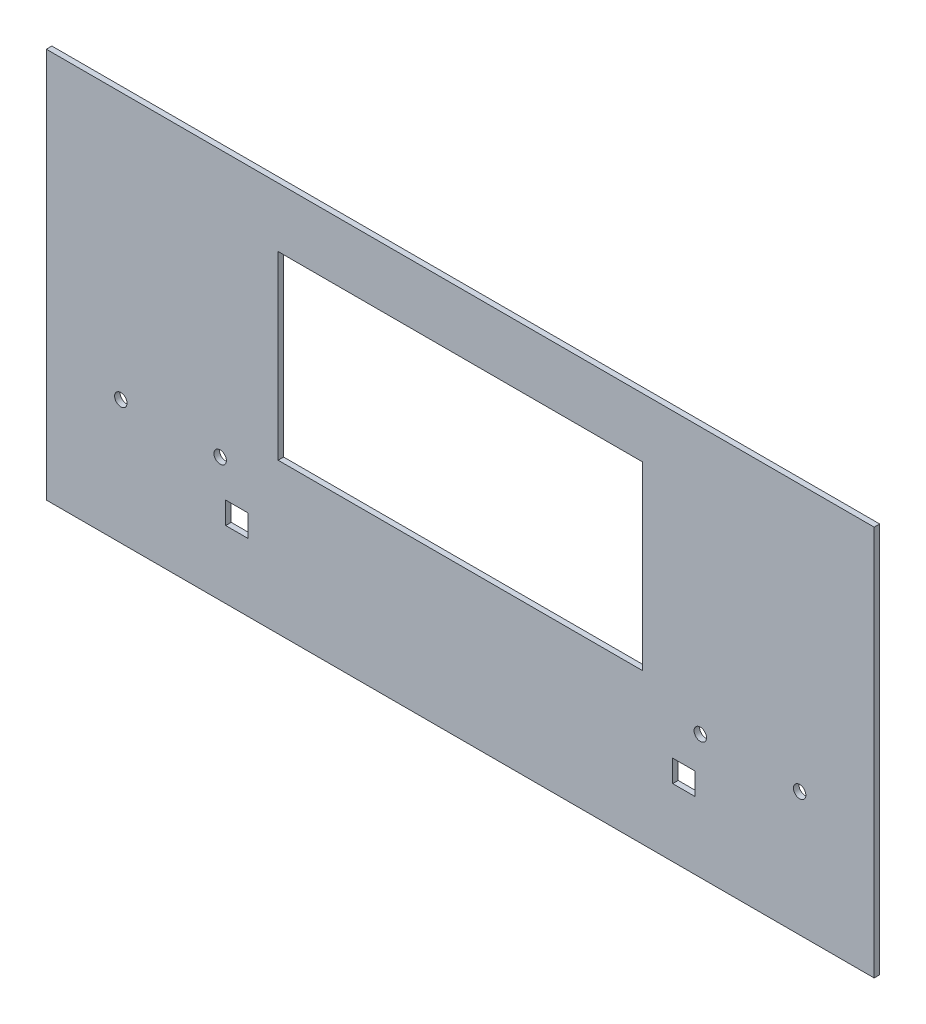
ISO-10303-21;
HEADER;
FILE_DESCRIPTION(('STEP AP214'),'2;1');
FILE_NAME('part.step','',(''),(''),'','','');
FILE_SCHEMA(('AUTOMOTIVE_DESIGN { 1 0 10303 214 1 1 1 1 }'));
ENDSEC;
DATA;
#1=APPLICATION_CONTEXT('core data for automotive mechanical design processes');
#2=APPLICATION_PROTOCOL_DEFINITION('international standard','automotive_design',2000,#1);
#3=PRODUCT_CONTEXT('',#1,'mechanical');
#4=PRODUCT('Part','Part','',(#3));
#5=PRODUCT_RELATED_PRODUCT_CATEGORY('part','',(#4));
#6=PRODUCT_DEFINITION_FORMATION('','',#4);
#7=PRODUCT_DEFINITION_CONTEXT('part definition',#1,'design');
#8=PRODUCT_DEFINITION('design','',#6,#7);
#9=PRODUCT_DEFINITION_SHAPE('','',#8);
#10=(LENGTH_UNIT() NAMED_UNIT(*) SI_UNIT(.MILLI.,.METRE.));
#11=(NAMED_UNIT(*) PLANE_ANGLE_UNIT() SI_UNIT($,.RADIAN.));
#12=(NAMED_UNIT(*) SI_UNIT($,.STERADIAN.) SOLID_ANGLE_UNIT());
#13=UNCERTAINTY_MEASURE_WITH_UNIT(LENGTH_MEASURE(1.E-05),#10,'distance_accuracy_value','');
#14=(GEOMETRIC_REPRESENTATION_CONTEXT(3) GLOBAL_UNCERTAINTY_ASSIGNED_CONTEXT((#13)) GLOBAL_UNIT_ASSIGNED_CONTEXT((#10,
#11,#12)) REPRESENTATION_CONTEXT('',''));
#15=CARTESIAN_POINT('',(0.,0.,0.));
#16=DIRECTION('',(0.,0.,1.));
#17=DIRECTION('',(1.,0.,0.));
#18=AXIS2_PLACEMENT_3D('',#15,#16,#17);
#19=CARTESIAN_POINT('',(0.,0.,2.));
#20=DIRECTION('',(0.,0.,-1.));
#21=DIRECTION('',(-1.,0.,0.));
#22=AXIS2_PLACEMENT_3D('',#19,#20,#21);
#23=PLANE('',#22);
#24=DIRECTION('',(0.,-1.,0.));
#25=VECTOR('',#24,1.);
#26=CARTESIAN_POINT('',(-85.,24.5,2.));
#27=LINE('',#26,#25);
#28=CARTESIAN_POINT('',(-85.,32.5,2.));
#29=VERTEX_POINT('',#28);
#30=CARTESIAN_POINT('',(-85.,24.5,2.));
#31=VERTEX_POINT('',#30);
#32=EDGE_CURVE('E210',#29,#31,#27,.T.);
#33=ORIENTED_EDGE('',*,*,#32,.F.);
#34=DIRECTION('',(-1.,0.,0.));
#35=VECTOR('',#34,1.);
#36=CARTESIAN_POINT('',(-85.,32.5,2.));
#37=LINE('',#36,#35);
#38=CARTESIAN_POINT('',(-77.,32.5,2.));
#39=VERTEX_POINT('',#38);
#40=EDGE_CURVE('E205',#39,#29,#37,.T.);
#41=ORIENTED_EDGE('',*,*,#40,.F.);
#42=DIRECTION('',(0.,1.,0.));
#43=VECTOR('',#42,1.);
#44=CARTESIAN_POINT('',(-77.,24.5,2.));
#45=LINE('',#44,#43);
#46=CARTESIAN_POINT('',(-77.,24.5,2.));
#47=VERTEX_POINT('',#46);
#48=EDGE_CURVE('E217',#47,#39,#45,.T.);
#49=ORIENTED_EDGE('',*,*,#48,.F.);
#50=DIRECTION('',(1.,0.,0.));
#51=VECTOR('',#50,1.);
#52=CARTESIAN_POINT('',(-85.,24.5,2.));
#53=LINE('',#52,#51);
#54=EDGE_CURVE('E219',#31,#47,#53,.T.);
#55=ORIENTED_EDGE('',*,*,#54,.F.);
#56=EDGE_LOOP('',(#33,#41,#49,#55));
#57=FACE_BOUND('',#56,.T.);
#58=CARTESIAN_POINT('',(123.,45.,2.));
#59=DIRECTION('',(0.,0.,1.));
#60=DIRECTION('',(1.,0.,0.));
#61=AXIS2_PLACEMENT_3D('',#58,#59,#60);
#62=CIRCLE('',#61,2.25);
#63=CARTESIAN_POINT('',(125.25,45.,2.));
#64=VERTEX_POINT('',#63);
#65=EDGE_CURVE('E223',#64,#64,#62,.T.);
#66=ORIENTED_EDGE('',*,*,#65,.F.);
#67=EDGE_LOOP('',(#66));
#68=FACE_BOUND('',#67,.T.);
#69=CARTESIAN_POINT('',(-87.,45.,2.));
#70=DIRECTION('',(0.,0.,1.));
#71=DIRECTION('',(1.,0.,0.));
#72=AXIS2_PLACEMENT_3D('',#69,#70,#71);
#73=CIRCLE('',#72,2.25);
#74=CARTESIAN_POINT('',(-84.75,45.,2.));
#75=VERTEX_POINT('',#74);
#76=EDGE_CURVE('E171',#75,#75,#73,.T.);
#77=ORIENTED_EDGE('',*,*,#76,.F.);
#78=EDGE_LOOP('',(#77));
#79=FACE_BOUND('',#78,.T.);
#80=CARTESIAN_POINT('',(-123.,45.,2.));
#81=DIRECTION('',(0.,0.,1.));
#82=DIRECTION('',(1.,0.,0.));
#83=AXIS2_PLACEMENT_3D('',#80,#81,#82);
#84=CIRCLE('',#83,2.25);
#85=CARTESIAN_POINT('',(-120.75,45.,2.));
#86=VERTEX_POINT('',#85);
#87=EDGE_CURVE('E235',#86,#86,#84,.T.);
#88=ORIENTED_EDGE('',*,*,#87,.F.);
#89=EDGE_LOOP('',(#88));
#90=FACE_BOUND('',#89,.T.);
#91=CARTESIAN_POINT('',(87.,45.,2.));
#92=DIRECTION('',(0.,0.,1.));
#93=DIRECTION('',(1.,0.,0.));
#94=AXIS2_PLACEMENT_3D('',#91,#92,#93);
#95=CIRCLE('',#94,2.25);
#96=CARTESIAN_POINT('',(89.25,45.,2.));
#97=VERTEX_POINT('',#96);
#98=EDGE_CURVE('E240',#97,#97,#95,.T.);
#99=ORIENTED_EDGE('',*,*,#98,.F.);
#100=EDGE_LOOP('',(#99));
#101=FACE_BOUND('',#100,.T.);
#102=DIRECTION('',(0.,-1.,0.));
#103=VECTOR('',#102,1.);
#104=CARTESIAN_POINT('',(-150.,0.,2.));
#105=LINE('',#104,#103);
#106=CARTESIAN_POINT('',(-150.,141.5,2.));
#107=VERTEX_POINT('',#106);
#108=CARTESIAN_POINT('',(-150.,0.,2.));
#109=VERTEX_POINT('',#108);
#110=EDGE_CURVE('E277',#107,#109,#105,.T.);
#111=ORIENTED_EDGE('',*,*,#110,.T.);
#112=DIRECTION('',(1.,0.,0.));
#113=VECTOR('',#112,1.);
#114=CARTESIAN_POINT('',(-150.,0.,2.));
#115=LINE('',#114,#113);
#116=CARTESIAN_POINT('',(150.,0.,2.));
#117=VERTEX_POINT('',#116);
#118=EDGE_CURVE('E276',#109,#117,#115,.T.);
#119=ORIENTED_EDGE('',*,*,#118,.T.);
#120=DIRECTION('',(0.,1.,0.));
#121=VECTOR('',#120,1.);
#122=CARTESIAN_POINT('',(150.,0.,2.));
#123=LINE('',#122,#121);
#124=CARTESIAN_POINT('',(150.,141.5,2.));
#125=VERTEX_POINT('',#124);
#126=EDGE_CURVE('E285',#117,#125,#123,.T.);
#127=ORIENTED_EDGE('',*,*,#126,.T.);
#128=DIRECTION('',(-1.,0.,0.));
#129=VECTOR('',#128,1.);
#130=CARTESIAN_POINT('',(-150.,141.5,2.));
#131=LINE('',#130,#129);
#132=EDGE_CURVE('E281',#125,#107,#131,.T.);
#133=ORIENTED_EDGE('',*,*,#132,.T.);
#134=EDGE_LOOP('',(#111,#119,#127,#133));
#135=FACE_BOUND('',#134,.T.);
#136=DIRECTION('',(0.,-1.,0.));
#137=VECTOR('',#136,1.);
#138=CARTESIAN_POINT('',(-66.,54.5,2.));
#139=LINE('',#138,#137);
#140=CARTESIAN_POINT('',(-66.,120.,2.));
#141=VERTEX_POINT('',#140);
#142=CARTESIAN_POINT('',(-66.,54.5,2.));
#143=VERTEX_POINT('',#142);
#144=EDGE_CURVE('E244',#141,#143,#139,.T.);
#145=ORIENTED_EDGE('',*,*,#144,.F.);
#146=DIRECTION('',(-1.,0.,0.));
#147=VECTOR('',#146,1.);
#148=CARTESIAN_POINT('',(-66.,120.,2.));
#149=LINE('',#148,#147);
#150=CARTESIAN_POINT('',(66.,120.,2.));
#151=VERTEX_POINT('',#150);
#152=EDGE_CURVE('E254',#151,#141,#149,.T.);
#153=ORIENTED_EDGE('',*,*,#152,.F.);
#154=DIRECTION('',(0.,1.,0.));
#155=VECTOR('',#154,1.);
#156=CARTESIAN_POINT('',(66.,54.5,2.));
#157=LINE('',#156,#155);
#158=CARTESIAN_POINT('',(66.,54.5,2.));
#159=VERTEX_POINT('',#158);
#160=EDGE_CURVE('E249',#159,#151,#157,.T.);
#161=ORIENTED_EDGE('',*,*,#160,.F.);
#162=DIRECTION('',(1.,0.,0.));
#163=VECTOR('',#162,1.);
#164=CARTESIAN_POINT('',(-66.,54.5,2.));
#165=LINE('',#164,#163);
#166=EDGE_CURVE('E250',#143,#159,#165,.T.);
#167=ORIENTED_EDGE('',*,*,#166,.F.);
#168=EDGE_LOOP('',(#145,#153,#161,#167));
#169=FACE_BOUND('',#168,.T.);
#170=DIRECTION('',(0.,-1.,0.));
#171=VECTOR('',#170,1.);
#172=CARTESIAN_POINT('',(77.,24.5,2.));
#173=LINE('',#172,#171);
#174=CARTESIAN_POINT('',(77.,32.5,2.));
#175=VERTEX_POINT('',#174);
#176=CARTESIAN_POINT('',(77.,24.5,2.));
#177=VERTEX_POINT('',#176);
#178=EDGE_CURVE('E154',#175,#177,#173,.T.);
#179=ORIENTED_EDGE('',*,*,#178,.F.);
#180=DIRECTION('',(-1.,0.,0.));
#181=VECTOR('',#180,1.);
#182=CARTESIAN_POINT('',(77.,32.5,2.));
#183=LINE('',#182,#181);
#184=CARTESIAN_POINT('',(85.,32.5,2.));
#185=VERTEX_POINT('',#184);
#186=EDGE_CURVE('E180',#185,#175,#183,.T.);
#187=ORIENTED_EDGE('',*,*,#186,.F.);
#188=DIRECTION('',(0.,1.,0.));
#189=VECTOR('',#188,1.);
#190=CARTESIAN_POINT('',(85.,24.5,2.));
#191=LINE('',#190,#189);
#192=CARTESIAN_POINT('',(85.,24.5,2.));
#193=VERTEX_POINT('',#192);
#194=EDGE_CURVE('E174',#193,#185,#191,.T.);
#195=ORIENTED_EDGE('',*,*,#194,.F.);
#196=DIRECTION('',(1.,0.,0.));
#197=VECTOR('',#196,1.);
#198=CARTESIAN_POINT('',(77.,24.5,2.));
#199=LINE('',#198,#197);
#200=EDGE_CURVE('E161',#177,#193,#199,.T.);
#201=ORIENTED_EDGE('',*,*,#200,.F.);
#202=EDGE_LOOP('',(#179,#187,#195,#201));
#203=FACE_BOUND('',#202,.T.);
#204=ADVANCED_FACE('F39',(#57,#68,#79,#90,#101,#135,#169,#203),#23,.F.);
#205=CARTESIAN_POINT('',(0.,0.,0.));
#206=DIRECTION('',(0.,0.,-1.));
#207=DIRECTION('',(-1.,0.,0.));
#208=AXIS2_PLACEMENT_3D('',#205,#206,#207);
#209=PLANE('',#208);
#210=CARTESIAN_POINT('',(123.,45.,0.));
#211=DIRECTION('',(0.,0.,1.));
#212=DIRECTION('',(1.,0.,0.));
#213=AXIS2_PLACEMENT_3D('',#210,#211,#212);
#214=CIRCLE('',#213,2.25);
#215=CARTESIAN_POINT('',(125.25,45.,0.));
#216=VERTEX_POINT('',#215);
#217=EDGE_CURVE('E224',#216,#216,#214,.T.);
#218=ORIENTED_EDGE('',*,*,#217,.T.);
#219=EDGE_LOOP('',(#218));
#220=FACE_BOUND('',#219,.T.);
#221=CARTESIAN_POINT('',(-87.,45.,0.));
#222=DIRECTION('',(0.,0.,1.));
#223=DIRECTION('',(1.,0.,0.));
#224=AXIS2_PLACEMENT_3D('',#221,#222,#223);
#225=CIRCLE('',#224,2.25);
#226=CARTESIAN_POINT('',(-84.75,45.,0.));
#227=VERTEX_POINT('',#226);
#228=EDGE_CURVE('E230',#227,#227,#225,.T.);
#229=ORIENTED_EDGE('',*,*,#228,.T.);
#230=EDGE_LOOP('',(#229));
#231=FACE_BOUND('',#230,.T.);
#232=CARTESIAN_POINT('',(-123.,45.,0.));
#233=DIRECTION('',(0.,0.,1.));
#234=DIRECTION('',(1.,0.,0.));
#235=AXIS2_PLACEMENT_3D('',#232,#233,#234);
#236=CIRCLE('',#235,2.25);
#237=CARTESIAN_POINT('',(-120.75,45.,0.));
#238=VERTEX_POINT('',#237);
#239=EDGE_CURVE('E239',#238,#238,#236,.T.);
#240=ORIENTED_EDGE('',*,*,#239,.T.);
#241=EDGE_LOOP('',(#240));
#242=FACE_BOUND('',#241,.T.);
#243=CARTESIAN_POINT('',(87.,45.,0.));
#244=DIRECTION('',(0.,0.,1.));
#245=DIRECTION('',(1.,0.,0.));
#246=AXIS2_PLACEMENT_3D('',#243,#244,#245);
#247=CIRCLE('',#246,2.25);
#248=CARTESIAN_POINT('',(89.25,45.,0.));
#249=VERTEX_POINT('',#248);
#250=EDGE_CURVE('E226',#249,#249,#247,.T.);
#251=ORIENTED_EDGE('',*,*,#250,.T.);
#252=EDGE_LOOP('',(#251));
#253=FACE_BOUND('',#252,.T.);
#254=DIRECTION('',(0.,-1.,0.));
#255=VECTOR('',#254,1.);
#256=CARTESIAN_POINT('',(-150.,0.,0.));
#257=LINE('',#256,#255);
#258=CARTESIAN_POINT('',(-150.,141.5,0.));
#259=VERTEX_POINT('',#258);
#260=CARTESIAN_POINT('',(-150.,0.,0.));
#261=VERTEX_POINT('',#260);
#262=EDGE_CURVE('E273',#259,#261,#257,.T.);
#263=ORIENTED_EDGE('',*,*,#262,.F.);
#264=DIRECTION('',(-1.,0.,0.));
#265=VECTOR('',#264,1.);
#266=CARTESIAN_POINT('',(-150.,141.5,0.));
#267=LINE('',#266,#265);
#268=CARTESIAN_POINT('',(150.,141.5,0.));
#269=VERTEX_POINT('',#268);
#270=EDGE_CURVE('E278',#269,#259,#267,.T.);
#271=ORIENTED_EDGE('',*,*,#270,.F.);
#272=DIRECTION('',(0.,1.,0.));
#273=VECTOR('',#272,1.);
#274=CARTESIAN_POINT('',(150.,0.,0.));
#275=LINE('',#274,#273);
#276=CARTESIAN_POINT('',(150.,0.,0.));
#277=VERTEX_POINT('',#276);
#278=EDGE_CURVE('E293',#277,#269,#275,.T.);
#279=ORIENTED_EDGE('',*,*,#278,.F.);
#280=DIRECTION('',(1.,0.,0.));
#281=VECTOR('',#280,1.);
#282=CARTESIAN_POINT('',(-150.,0.,0.));
#283=LINE('',#282,#281);
#284=EDGE_CURVE('E287',#261,#277,#283,.T.);
#285=ORIENTED_EDGE('',*,*,#284,.F.);
#286=EDGE_LOOP('',(#263,#271,#279,#285));
#287=FACE_BOUND('',#286,.T.);
#288=DIRECTION('',(-1.,0.,0.));
#289=VECTOR('',#288,1.);
#290=CARTESIAN_POINT('',(-66.,120.,0.));
#291=LINE('',#290,#289);
#292=CARTESIAN_POINT('',(66.,120.,0.));
#293=VERTEX_POINT('',#292);
#294=CARTESIAN_POINT('',(-66.,120.,0.));
#295=VERTEX_POINT('',#294);
#296=EDGE_CURVE('E247',#293,#295,#291,.T.);
#297=ORIENTED_EDGE('',*,*,#296,.T.);
#298=DIRECTION('',(0.,-1.,0.));
#299=VECTOR('',#298,1.);
#300=CARTESIAN_POINT('',(-66.,54.5,0.));
#301=LINE('',#300,#299);
#302=CARTESIAN_POINT('',(-66.,54.5,0.));
#303=VERTEX_POINT('',#302);
#304=EDGE_CURVE('E222',#295,#303,#301,.T.);
#305=ORIENTED_EDGE('',*,*,#304,.T.);
#306=DIRECTION('',(1.,0.,0.));
#307=VECTOR('',#306,1.);
#308=CARTESIAN_POINT('',(-66.,54.5,0.));
#309=LINE('',#308,#307);
#310=CARTESIAN_POINT('',(66.,54.5,0.));
#311=VERTEX_POINT('',#310);
#312=EDGE_CURVE('E259',#303,#311,#309,.T.);
#313=ORIENTED_EDGE('',*,*,#312,.T.);
#314=DIRECTION('',(0.,1.,0.));
#315=VECTOR('',#314,1.);
#316=CARTESIAN_POINT('',(66.,54.5,0.));
#317=LINE('',#316,#315);
#318=EDGE_CURVE('E262',#311,#293,#317,.T.);
#319=ORIENTED_EDGE('',*,*,#318,.T.);
#320=EDGE_LOOP('',(#297,#305,#313,#319));
#321=FACE_BOUND('',#320,.T.);
#322=DIRECTION('',(-1.,0.,0.));
#323=VECTOR('',#322,1.);
#324=CARTESIAN_POINT('',(-85.,32.5,0.));
#325=LINE('',#324,#323);
#326=CARTESIAN_POINT('',(-77.,32.5,0.));
#327=VERTEX_POINT('',#326);
#328=CARTESIAN_POINT('',(-85.,32.5,0.));
#329=VERTEX_POINT('',#328);
#330=EDGE_CURVE('E201',#327,#329,#325,.T.);
#331=ORIENTED_EDGE('',*,*,#330,.T.);
#332=DIRECTION('',(0.,-1.,0.));
#333=VECTOR('',#332,1.);
#334=CARTESIAN_POINT('',(-85.,24.5,0.));
#335=LINE('',#334,#333);
#336=CARTESIAN_POINT('',(-85.,24.5,0.));
#337=VERTEX_POINT('',#336);
#338=EDGE_CURVE('E182',#329,#337,#335,.T.);
#339=ORIENTED_EDGE('',*,*,#338,.T.);
#340=DIRECTION('',(1.,0.,0.));
#341=VECTOR('',#340,1.);
#342=CARTESIAN_POINT('',(-85.,24.5,0.));
#343=LINE('',#342,#341);
#344=CARTESIAN_POINT('',(-77.,24.5,0.));
#345=VERTEX_POINT('',#344);
#346=EDGE_CURVE('E208',#337,#345,#343,.T.);
#347=ORIENTED_EDGE('',*,*,#346,.T.);
#348=DIRECTION('',(0.,1.,0.));
#349=VECTOR('',#348,1.);
#350=CARTESIAN_POINT('',(-77.,24.5,0.));
#351=LINE('',#350,#349);
#352=EDGE_CURVE('E207',#345,#327,#351,.T.);
#353=ORIENTED_EDGE('',*,*,#352,.T.);
#354=EDGE_LOOP('',(#331,#339,#347,#353));
#355=FACE_BOUND('',#354,.T.);
#356=DIRECTION('',(-1.,0.,0.));
#357=VECTOR('',#356,1.);
#358=CARTESIAN_POINT('',(77.,32.5,0.));
#359=LINE('',#358,#357);
#360=CARTESIAN_POINT('',(85.,32.5,0.));
#361=VERTEX_POINT('',#360);
#362=CARTESIAN_POINT('',(77.,32.5,0.));
#363=VERTEX_POINT('',#362);
#364=EDGE_CURVE('E165',#361,#363,#359,.T.);
#365=ORIENTED_EDGE('',*,*,#364,.T.);
#366=DIRECTION('',(0.,-1.,0.));
#367=VECTOR('',#366,1.);
#368=CARTESIAN_POINT('',(77.,24.5,0.));
#369=LINE('',#368,#367);
#370=CARTESIAN_POINT('',(77.,24.5,0.));
#371=VERTEX_POINT('',#370);
#372=EDGE_CURVE('E181',#363,#371,#369,.T.);
#373=ORIENTED_EDGE('',*,*,#372,.T.);
#374=DIRECTION('',(1.,0.,0.));
#375=VECTOR('',#374,1.);
#376=CARTESIAN_POINT('',(77.,24.5,0.));
#377=LINE('',#376,#375);
#378=CARTESIAN_POINT('',(85.,24.5,0.));
#379=VERTEX_POINT('',#378);
#380=EDGE_CURVE('E167',#371,#379,#377,.T.);
#381=ORIENTED_EDGE('',*,*,#380,.T.);
#382=DIRECTION('',(0.,1.,0.));
#383=VECTOR('',#382,1.);
#384=CARTESIAN_POINT('',(85.,24.5,0.));
#385=LINE('',#384,#383);
#386=EDGE_CURVE('E184',#379,#361,#385,.T.);
#387=ORIENTED_EDGE('',*,*,#386,.T.);
#388=EDGE_LOOP('',(#365,#373,#381,#387));
#389=FACE_BOUND('',#388,.T.);
#390=ADVANCED_FACE('F307',(#220,#231,#242,#253,#287,#321,#355,#389),#209,.T.);
#391=CARTESIAN_POINT('',(-150.,0.,2.));
#392=DIRECTION('',(1.,0.,0.));
#393=DIRECTION('',(0.,0.,-1.));
#394=AXIS2_PLACEMENT_3D('',#391,#392,#393);
#395=PLANE('',#394);
#396=ORIENTED_EDGE('',*,*,#262,.T.);
#397=DIRECTION('',(0.,0.,-1.));
#398=VECTOR('',#397,1.);
#399=CARTESIAN_POINT('',(-150.,0.,2.));
#400=LINE('',#399,#398);
#401=EDGE_CURVE('E11',#109,#261,#400,.T.);
#402=ORIENTED_EDGE('',*,*,#401,.F.);
#403=ORIENTED_EDGE('',*,*,#110,.F.);
#404=DIRECTION('',(0.,0.,-1.));
#405=VECTOR('',#404,1.);
#406=CARTESIAN_POINT('',(-150.,141.5,2.));
#407=LINE('',#406,#405);
#408=EDGE_CURVE('E288',#107,#259,#407,.T.);
#409=ORIENTED_EDGE('',*,*,#408,.T.);
#410=EDGE_LOOP('',(#396,#402,#403,#409));
#411=FACE_BOUND('',#410,.T.);
#412=ADVANCED_FACE('F41',(#411),#395,.F.);
#413=CARTESIAN_POINT('',(-150.,0.,2.));
#414=DIRECTION('',(0.,1.,0.));
#415=DIRECTION('',(0.,0.,1.));
#416=AXIS2_PLACEMENT_3D('',#413,#414,#415);
#417=PLANE('',#416);
#418=ORIENTED_EDGE('',*,*,#284,.T.);
#419=DIRECTION('',(0.,0.,-1.));
#420=VECTOR('',#419,1.);
#421=CARTESIAN_POINT('',(150.,0.,2.));
#422=LINE('',#421,#420);
#423=EDGE_CURVE('E50',#117,#277,#422,.T.);
#424=ORIENTED_EDGE('',*,*,#423,.F.);
#425=ORIENTED_EDGE('',*,*,#118,.F.);
#426=ORIENTED_EDGE('',*,*,#401,.T.);
#427=EDGE_LOOP('',(#418,#424,#425,#426));
#428=FACE_BOUND('',#427,.T.);
#429=ADVANCED_FACE('F318',(#428),#417,.F.);
#430=CARTESIAN_POINT('',(150.,0.,2.));
#431=DIRECTION('',(-1.,0.,0.));
#432=DIRECTION('',(0.,0.,1.));
#433=AXIS2_PLACEMENT_3D('',#430,#431,#432);
#434=PLANE('',#433);
#435=ORIENTED_EDGE('',*,*,#278,.T.);
#436=DIRECTION('',(0.,0.,-1.));
#437=VECTOR('',#436,1.);
#438=CARTESIAN_POINT('',(150.,141.5,2.));
#439=LINE('',#438,#437);
#440=EDGE_CURVE('E298',#125,#269,#439,.T.);
#441=ORIENTED_EDGE('',*,*,#440,.F.);
#442=ORIENTED_EDGE('',*,*,#126,.F.);
#443=ORIENTED_EDGE('',*,*,#423,.T.);
#444=EDGE_LOOP('',(#435,#441,#442,#443));
#445=FACE_BOUND('',#444,.T.);
#446=ADVANCED_FACE('F303',(#445),#434,.F.);
#447=CARTESIAN_POINT('',(-150.,141.5,2.));
#448=DIRECTION('',(0.,-1.,0.));
#449=DIRECTION('',(0.,0.,-1.));
#450=AXIS2_PLACEMENT_3D('',#447,#448,#449);
#451=PLANE('',#450);
#452=ORIENTED_EDGE('',*,*,#270,.T.);
#453=ORIENTED_EDGE('',*,*,#408,.F.);
#454=ORIENTED_EDGE('',*,*,#132,.F.);
#455=ORIENTED_EDGE('',*,*,#440,.T.);
#456=EDGE_LOOP('',(#452,#453,#454,#455));
#457=FACE_BOUND('',#456,.T.);
#458=ADVANCED_FACE('F312',(#457),#451,.F.);
#459=CARTESIAN_POINT('',(-66.,54.5,2.));
#460=DIRECTION('',(1.,0.,0.));
#461=DIRECTION('',(0.,0.,-1.));
#462=AXIS2_PLACEMENT_3D('',#459,#460,#461);
#463=PLANE('',#462);
#464=ORIENTED_EDGE('',*,*,#304,.F.);
#465=DIRECTION('',(0.,0.,-1.));
#466=VECTOR('',#465,1.);
#467=CARTESIAN_POINT('',(-66.,120.,2.));
#468=LINE('',#467,#466);
#469=EDGE_CURVE('E253',#141,#295,#468,.T.);
#470=ORIENTED_EDGE('',*,*,#469,.F.);
#471=ORIENTED_EDGE('',*,*,#144,.T.);
#472=DIRECTION('',(0.,0.,-1.));
#473=VECTOR('',#472,1.);
#474=CARTESIAN_POINT('',(-66.,54.5,2.));
#475=LINE('',#474,#473);
#476=EDGE_CURVE('E275',#143,#303,#475,.T.);
#477=ORIENTED_EDGE('',*,*,#476,.T.);
#478=EDGE_LOOP('',(#464,#470,#471,#477));
#479=FACE_BOUND('',#478,.T.);
#480=ADVANCED_FACE('F339',(#479),#463,.T.);
#481=CARTESIAN_POINT('',(-66.,54.5,2.));
#482=DIRECTION('',(0.,1.,0.));
#483=DIRECTION('',(0.,0.,1.));
#484=AXIS2_PLACEMENT_3D('',#481,#482,#483);
#485=PLANE('',#484);
#486=ORIENTED_EDGE('',*,*,#312,.F.);
#487=ORIENTED_EDGE('',*,*,#476,.F.);
#488=ORIENTED_EDGE('',*,*,#166,.T.);
#489=DIRECTION('',(0.,0.,-1.));
#490=VECTOR('',#489,1.);
#491=CARTESIAN_POINT('',(66.,54.5,2.));
#492=LINE('',#491,#490);
#493=EDGE_CURVE('E269',#159,#311,#492,.T.);
#494=ORIENTED_EDGE('',*,*,#493,.T.);
#495=EDGE_LOOP('',(#486,#487,#488,#494));
#496=FACE_BOUND('',#495,.T.);
#497=ADVANCED_FACE('F347',(#496),#485,.T.);
#498=CARTESIAN_POINT('',(66.,54.5,2.));
#499=DIRECTION('',(-1.,0.,0.));
#500=DIRECTION('',(0.,0.,1.));
#501=AXIS2_PLACEMENT_3D('',#498,#499,#500);
#502=PLANE('',#501);
#503=ORIENTED_EDGE('',*,*,#318,.F.);
#504=ORIENTED_EDGE('',*,*,#493,.F.);
#505=ORIENTED_EDGE('',*,*,#160,.T.);
#506=DIRECTION('',(0.,0.,-1.));
#507=VECTOR('',#506,1.);
#508=CARTESIAN_POINT('',(66.,120.,2.));
#509=LINE('',#508,#507);
#510=EDGE_CURVE('E266',#151,#293,#509,.T.);
#511=ORIENTED_EDGE('',*,*,#510,.T.);
#512=EDGE_LOOP('',(#503,#504,#505,#511));
#513=FACE_BOUND('',#512,.T.);
#514=ADVANCED_FACE('F353',(#513),#502,.T.);
#515=CARTESIAN_POINT('',(-66.,120.,2.));
#516=DIRECTION('',(0.,-1.,0.));
#517=DIRECTION('',(0.,0.,-1.));
#518=AXIS2_PLACEMENT_3D('',#515,#516,#517);
#519=PLANE('',#518);
#520=ORIENTED_EDGE('',*,*,#296,.F.);
#521=ORIENTED_EDGE('',*,*,#510,.F.);
#522=ORIENTED_EDGE('',*,*,#152,.T.);
#523=ORIENTED_EDGE('',*,*,#469,.T.);
#524=EDGE_LOOP('',(#520,#521,#522,#523));
#525=FACE_BOUND('',#524,.T.);
#526=ADVANCED_FACE('F356',(#525),#519,.T.);
#527=CARTESIAN_POINT('',(87.,45.,2.));
#528=DIRECTION('',(0.,0.,-1.));
#529=DIRECTION('',(-1.,0.,0.));
#530=AXIS2_PLACEMENT_3D('',#527,#528,#529);
#531=CYLINDRICAL_SURFACE('',#530,2.25);
#532=ORIENTED_EDGE('',*,*,#98,.T.);
#533=EDGE_LOOP('',(#532));
#534=FACE_BOUND('',#533,.T.);
#535=ORIENTED_EDGE('',*,*,#250,.F.);
#536=EDGE_LOOP('',(#535));
#537=FACE_BOUND('',#536,.T.);
#538=ADVANCED_FACE('F371',(#534,#537),#531,.F.);
#539=CARTESIAN_POINT('',(-123.,45.,2.));
#540=DIRECTION('',(0.,0.,-1.));
#541=DIRECTION('',(-1.,0.,0.));
#542=AXIS2_PLACEMENT_3D('',#539,#540,#541);
#543=CYLINDRICAL_SURFACE('',#542,2.25);
#544=ORIENTED_EDGE('',*,*,#87,.T.);
#545=EDGE_LOOP('',(#544));
#546=FACE_BOUND('',#545,.T.);
#547=ORIENTED_EDGE('',*,*,#239,.F.);
#548=EDGE_LOOP('',(#547));
#549=FACE_BOUND('',#548,.T.);
#550=ADVANCED_FACE('F372',(#546,#549),#543,.F.);
#551=CARTESIAN_POINT('',(-87.,45.,2.));
#552=DIRECTION('',(0.,0.,-1.));
#553=DIRECTION('',(-1.,0.,0.));
#554=AXIS2_PLACEMENT_3D('',#551,#552,#553);
#555=CYLINDRICAL_SURFACE('',#554,2.25);
#556=ORIENTED_EDGE('',*,*,#76,.T.);
#557=EDGE_LOOP('',(#556));
#558=FACE_BOUND('',#557,.T.);
#559=ORIENTED_EDGE('',*,*,#228,.F.);
#560=EDGE_LOOP('',(#559));
#561=FACE_BOUND('',#560,.T.);
#562=ADVANCED_FACE('F380',(#558,#561),#555,.F.);
#563=CARTESIAN_POINT('',(123.,45.,2.));
#564=DIRECTION('',(0.,0.,-1.));
#565=DIRECTION('',(-1.,0.,0.));
#566=AXIS2_PLACEMENT_3D('',#563,#564,#565);
#567=CYLINDRICAL_SURFACE('',#566,2.25);
#568=ORIENTED_EDGE('',*,*,#65,.T.);
#569=EDGE_LOOP('',(#568));
#570=FACE_BOUND('',#569,.T.);
#571=ORIENTED_EDGE('',*,*,#217,.F.);
#572=EDGE_LOOP('',(#571));
#573=FACE_BOUND('',#572,.T.);
#574=ADVANCED_FACE('F381',(#570,#573),#567,.F.);
#575=CARTESIAN_POINT('',(-85.,24.5,2.));
#576=DIRECTION('',(1.,0.,0.));
#577=DIRECTION('',(0.,0.,-1.));
#578=AXIS2_PLACEMENT_3D('',#575,#576,#577);
#579=PLANE('',#578);
#580=ORIENTED_EDGE('',*,*,#338,.F.);
#581=DIRECTION('',(0.,0.,-1.));
#582=VECTOR('',#581,1.);
#583=CARTESIAN_POINT('',(-85.,32.5,2.));
#584=LINE('',#583,#582);
#585=EDGE_CURVE('E196',#29,#329,#584,.T.);
#586=ORIENTED_EDGE('',*,*,#585,.F.);
#587=ORIENTED_EDGE('',*,*,#32,.T.);
#588=DIRECTION('',(0.,0.,-1.));
#589=VECTOR('',#588,1.);
#590=CARTESIAN_POINT('',(-85.,24.5,2.));
#591=LINE('',#590,#589);
#592=EDGE_CURVE('E194',#31,#337,#591,.T.);
#593=ORIENTED_EDGE('',*,*,#592,.T.);
#594=EDGE_LOOP('',(#580,#586,#587,#593));
#595=FACE_BOUND('',#594,.T.);
#596=ADVANCED_FACE('F390',(#595),#579,.T.);
#597=CARTESIAN_POINT('',(-85.,24.5,2.));
#598=DIRECTION('',(0.,1.,0.));
#599=DIRECTION('',(0.,0.,1.));
#600=AXIS2_PLACEMENT_3D('',#597,#598,#599);
#601=PLANE('',#600);
#602=ORIENTED_EDGE('',*,*,#346,.F.);
#603=ORIENTED_EDGE('',*,*,#592,.F.);
#604=ORIENTED_EDGE('',*,*,#54,.T.);
#605=DIRECTION('',(0.,0.,-1.));
#606=VECTOR('',#605,1.);
#607=CARTESIAN_POINT('',(-77.,24.5,2.));
#608=LINE('',#607,#606);
#609=EDGE_CURVE('E197',#47,#345,#608,.T.);
#610=ORIENTED_EDGE('',*,*,#609,.T.);
#611=EDGE_LOOP('',(#602,#603,#604,#610));
#612=FACE_BOUND('',#611,.T.);
#613=ADVANCED_FACE('F393',(#612),#601,.T.);
#614=CARTESIAN_POINT('',(-77.,24.5,2.));
#615=DIRECTION('',(-1.,0.,0.));
#616=DIRECTION('',(0.,0.,1.));
#617=AXIS2_PLACEMENT_3D('',#614,#615,#616);
#618=PLANE('',#617);
#619=ORIENTED_EDGE('',*,*,#352,.F.);
#620=ORIENTED_EDGE('',*,*,#609,.F.);
#621=ORIENTED_EDGE('',*,*,#48,.T.);
#622=DIRECTION('',(0.,0.,-1.));
#623=VECTOR('',#622,1.);
#624=CARTESIAN_POINT('',(-77.,32.5,2.));
#625=LINE('',#624,#623);
#626=EDGE_CURVE('E65',#39,#327,#625,.T.);
#627=ORIENTED_EDGE('',*,*,#626,.T.);
#628=EDGE_LOOP('',(#619,#620,#621,#627));
#629=FACE_BOUND('',#628,.T.);
#630=ADVANCED_FACE('F395',(#629),#618,.T.);
#631=CARTESIAN_POINT('',(-85.,32.5,2.));
#632=DIRECTION('',(0.,-1.,0.));
#633=DIRECTION('',(0.,0.,-1.));
#634=AXIS2_PLACEMENT_3D('',#631,#632,#633);
#635=PLANE('',#634);
#636=ORIENTED_EDGE('',*,*,#330,.F.);
#637=ORIENTED_EDGE('',*,*,#626,.F.);
#638=ORIENTED_EDGE('',*,*,#40,.T.);
#639=ORIENTED_EDGE('',*,*,#585,.T.);
#640=EDGE_LOOP('',(#636,#637,#638,#639));
#641=FACE_BOUND('',#640,.T.);
#642=ADVANCED_FACE('F386',(#641),#635,.T.);
#643=CARTESIAN_POINT('',(77.,24.5,2.));
#644=DIRECTION('',(1.,0.,0.));
#645=DIRECTION('',(0.,0.,-1.));
#646=AXIS2_PLACEMENT_3D('',#643,#644,#645);
#647=PLANE('',#646);
#648=ORIENTED_EDGE('',*,*,#372,.F.);
#649=DIRECTION('',(0.,0.,-1.));
#650=VECTOR('',#649,1.);
#651=CARTESIAN_POINT('',(77.,32.5,2.));
#652=LINE('',#651,#650);
#653=EDGE_CURVE('E157',#175,#363,#652,.T.);
#654=ORIENTED_EDGE('',*,*,#653,.F.);
#655=ORIENTED_EDGE('',*,*,#178,.T.);
#656=DIRECTION('',(0.,0.,-1.));
#657=VECTOR('',#656,1.);
#658=CARTESIAN_POINT('',(77.,24.5,2.));
#659=LINE('',#658,#657);
#660=EDGE_CURVE('E158',#177,#371,#659,.T.);
#661=ORIENTED_EDGE('',*,*,#660,.T.);
#662=EDGE_LOOP('',(#648,#654,#655,#661));
#663=FACE_BOUND('',#662,.T.);
#664=ADVANCED_FACE('F153',(#663),#647,.T.);
#665=CARTESIAN_POINT('',(77.,24.5,2.));
#666=DIRECTION('',(0.,1.,0.));
#667=DIRECTION('',(0.,0.,1.));
#668=AXIS2_PLACEMENT_3D('',#665,#666,#667);
#669=PLANE('',#668);
#670=ORIENTED_EDGE('',*,*,#380,.F.);
#671=ORIENTED_EDGE('',*,*,#660,.F.);
#672=ORIENTED_EDGE('',*,*,#200,.T.);
#673=DIRECTION('',(0.,0.,-1.));
#674=VECTOR('',#673,1.);
#675=CARTESIAN_POINT('',(85.,24.5,2.));
#676=LINE('',#675,#674);
#677=EDGE_CURVE('E175',#193,#379,#676,.T.);
#678=ORIENTED_EDGE('',*,*,#677,.T.);
#679=EDGE_LOOP('',(#670,#671,#672,#678));
#680=FACE_BOUND('',#679,.T.);
#681=ADVANCED_FACE('F170',(#680),#669,.T.);
#682=CARTESIAN_POINT('',(85.,24.5,2.));
#683=DIRECTION('',(-1.,0.,0.));
#684=DIRECTION('',(0.,0.,1.));
#685=AXIS2_PLACEMENT_3D('',#682,#683,#684);
#686=PLANE('',#685);
#687=ORIENTED_EDGE('',*,*,#386,.F.);
#688=ORIENTED_EDGE('',*,*,#677,.F.);
#689=ORIENTED_EDGE('',*,*,#194,.T.);
#690=DIRECTION('',(0.,0.,-1.));
#691=VECTOR('',#690,1.);
#692=CARTESIAN_POINT('',(85.,32.5,2.));
#693=LINE('',#692,#691);
#694=EDGE_CURVE('E53',#185,#361,#693,.T.);
#695=ORIENTED_EDGE('',*,*,#694,.T.);
#696=EDGE_LOOP('',(#687,#688,#689,#695));
#697=FACE_BOUND('',#696,.T.);
#698=ADVANCED_FACE('F410',(#697),#686,.T.);
#699=CARTESIAN_POINT('',(77.,32.5,2.));
#700=DIRECTION('',(0.,-1.,0.));
#701=DIRECTION('',(0.,0.,-1.));
#702=AXIS2_PLACEMENT_3D('',#699,#700,#701);
#703=PLANE('',#702);
#704=ORIENTED_EDGE('',*,*,#364,.F.);
#705=ORIENTED_EDGE('',*,*,#694,.F.);
#706=ORIENTED_EDGE('',*,*,#186,.T.);
#707=ORIENTED_EDGE('',*,*,#653,.T.);
#708=EDGE_LOOP('',(#704,#705,#706,#707));
#709=FACE_BOUND('',#708,.T.);
#710=ADVANCED_FACE('F408',(#709),#703,.T.);
#711=CLOSED_SHELL('',(#204,#390,#412,#429,#446,#458,#480,#497,#514,#526,#538,#550,#562,#574,
#596,#613,#630,#642,#664,#681,#698,#710));
#712=MANIFOLD_SOLID_BREP('B2',#711);
#713=ADVANCED_BREP_SHAPE_REPRESENTATION('',(#18,#712),#14);
#714=SHAPE_DEFINITION_REPRESENTATION(#9,#713);
ENDSEC;
END-ISO-10303-21;
